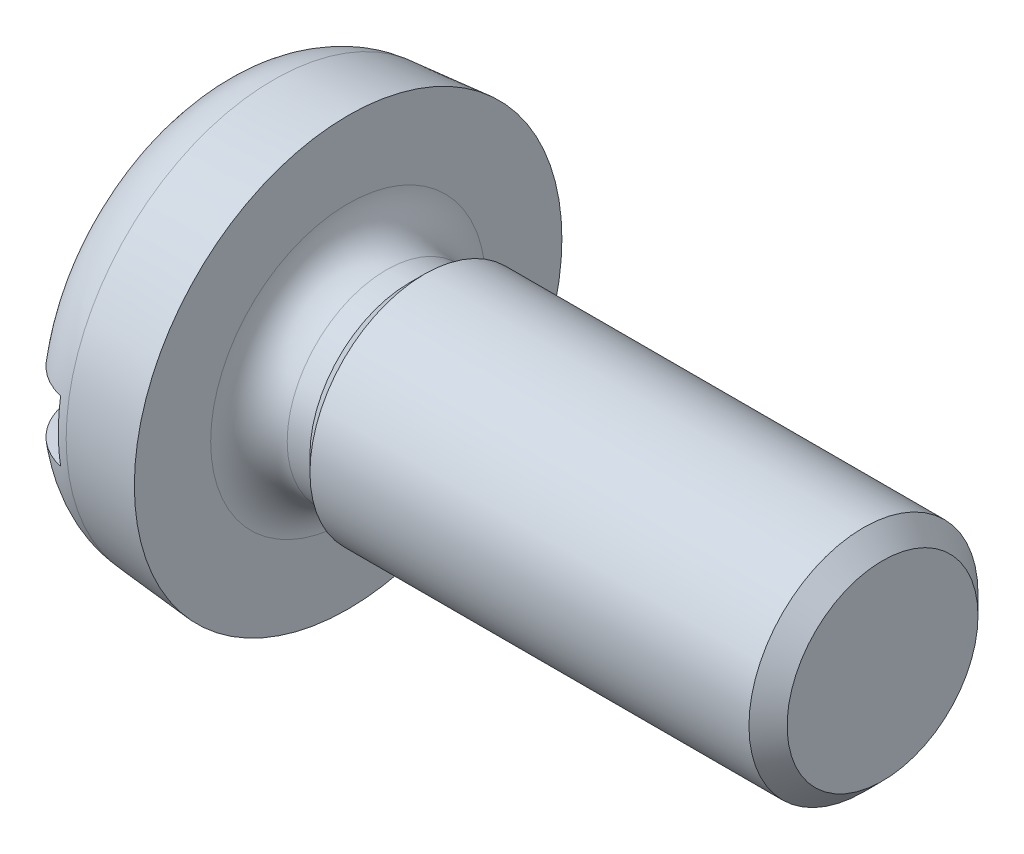
ISO-10303-21;
HEADER;
FILE_DESCRIPTION(('STEP AP214'),'2;1');
FILE_NAME('part.step','',(''),(''),'','','');
FILE_SCHEMA(('AUTOMOTIVE_DESIGN { 1 0 10303 214 1 1 1 1 }'));
ENDSEC;
DATA;
#1=APPLICATION_CONTEXT('core data for automotive mechanical design processes');
#2=APPLICATION_PROTOCOL_DEFINITION('international standard','automotive_design',2000,#1);
#3=PRODUCT_CONTEXT('',#1,'mechanical');
#4=PRODUCT('Part','Part','',(#3));
#5=PRODUCT_RELATED_PRODUCT_CATEGORY('part','',(#4));
#6=PRODUCT_DEFINITION_FORMATION('','',#4);
#7=PRODUCT_DEFINITION_CONTEXT('part definition',#1,'design');
#8=PRODUCT_DEFINITION('design','',#6,#7);
#9=PRODUCT_DEFINITION_SHAPE('','',#8);
#10=(LENGTH_UNIT() NAMED_UNIT(*) SI_UNIT(.MILLI.,.METRE.));
#11=(NAMED_UNIT(*) PLANE_ANGLE_UNIT() SI_UNIT($,.RADIAN.));
#12=(NAMED_UNIT(*) SI_UNIT($,.STERADIAN.) SOLID_ANGLE_UNIT());
#13=UNCERTAINTY_MEASURE_WITH_UNIT(LENGTH_MEASURE(1.E-05),#10,'distance_accuracy_value','');
#14=(GEOMETRIC_REPRESENTATION_CONTEXT(3) GLOBAL_UNCERTAINTY_ASSIGNED_CONTEXT((#13)) GLOBAL_UNIT_ASSIGNED_CONTEXT((#10,
#11,#12)) REPRESENTATION_CONTEXT('',''));
#15=CARTESIAN_POINT('',(0.,0.,0.));
#16=DIRECTION('',(0.,0.,1.));
#17=DIRECTION('',(1.,0.,0.));
#18=AXIS2_PLACEMENT_3D('',#15,#16,#17);
#19=CARTESIAN_POINT('',(-2.4770215242466,0.,0.));
#20=DIRECTION('',(-1.,0.,0.));
#21=DIRECTION('',(0.,0.,1.));
#22=AXIS2_PLACEMENT_3D('',#19,#20,#21);
#23=CYLINDRICAL_SURFACE('',#22,1.5);
#24=CARTESIAN_POINT('',(8.55,0.,0.));
#25=DIRECTION('',(1.,0.,0.));
#26=DIRECTION('',(0.,0.,-1.));
#27=AXIS2_PLACEMENT_3D('',#24,#25,#26);
#28=CIRCLE('',#27,1.5);
#29=CARTESIAN_POINT('',(8.55,0.,-1.5));
#30=VERTEX_POINT('',#29);
#31=EDGE_CURVE('E11',#30,#30,#28,.F.);
#32=ORIENTED_EDGE('',*,*,#31,.T.);
#33=EDGE_LOOP('',(#32));
#34=FACE_BOUND('',#33,.T.);
#35=CARTESIAN_POINT('',(2.8,0.,0.));
#36=DIRECTION('',(-1.,0.,0.));
#37=DIRECTION('',(0.,0.,1.));
#38=AXIS2_PLACEMENT_3D('',#35,#36,#37);
#39=CIRCLE('',#38,1.5);
#40=CARTESIAN_POINT('',(2.8,0.,1.5));
#41=VERTEX_POINT('',#40);
#42=EDGE_CURVE('E163',#41,#41,#39,.T.);
#43=ORIENTED_EDGE('',*,*,#42,.F.);
#44=EDGE_LOOP('',(#43));
#45=FACE_BOUND('',#44,.T.);
#46=ADVANCED_FACE('F39',(#34,#45),#23,.T.);
#47=CARTESIAN_POINT('',(0.,1.81782234903766,0.));
#48=DIRECTION('',(1.,0.,0.));
#49=DIRECTION('',(0.,0.,-1.));
#50=AXIS2_PLACEMENT_3D('',#47,#48,#49);
#51=PLANE('',#50);
#52=CARTESIAN_POINT('',(0.,0.,0.));
#53=DIRECTION('',(-1.,0.,0.));
#54=DIRECTION('',(0.,0.,1.));
#55=AXIS2_PLACEMENT_3D('',#52,#53,#54);
#56=CIRCLE('',#55,1.81782234903766);
#57=CARTESIAN_POINT('',(0.,0.4,1.77326763142533));
#58=VERTEX_POINT('',#57);
#59=CARTESIAN_POINT('',(0.,0.4,-1.77326763142534));
#60=VERTEX_POINT('',#59);
#61=EDGE_CURVE('E98',#58,#60,#56,.T.);
#62=ORIENTED_EDGE('',*,*,#61,.T.);
#63=DIRECTION('',(0.,0.,1.));
#64=VECTOR('',#63,1.);
#65=CARTESIAN_POINT('',(0.,0.4,-50.));
#66=LINE('',#65,#64);
#67=EDGE_CURVE('E166',#60,#58,#66,.T.);
#68=ORIENTED_EDGE('',*,*,#67,.T.);
#69=EDGE_LOOP('',(#62,#68));
#70=FACE_BOUND('',#69,.T.);
#71=ADVANCED_FACE('F154',(#70),#51,.F.);
#72=CARTESIAN_POINT('',(0.,-0.4,-1.77326763142533));
#73=VERTEX_POINT('',#72);
#74=CARTESIAN_POINT('',(0.,-0.4,1.77326763142533));
#75=VERTEX_POINT('',#74);
#76=EDGE_CURVE('E92',#73,#75,#56,.T.);
#77=ORIENTED_EDGE('',*,*,#76,.T.);
#78=DIRECTION('',(0.,0.,1.));
#79=VECTOR('',#78,1.);
#80=CARTESIAN_POINT('',(0.,-0.4,-50.));
#81=LINE('',#80,#79);
#82=EDGE_CURVE('E54',#73,#75,#81,.T.);
#83=ORIENTED_EDGE('',*,*,#82,.F.);
#84=EDGE_LOOP('',(#77,#83));
#85=FACE_BOUND('',#84,.T.);
#86=ADVANCED_FACE('F91',(#85),#51,.F.);
#87=CARTESIAN_POINT('',(0.9,0.,0.));
#88=DIRECTION('',(-1.,0.,0.));
#89=DIRECTION('',(0.,0.,1.));
#90=AXIS2_PLACEMENT_3D('',#87,#88,#89);
#91=TOROIDAL_SURFACE('',#90,1.81782234903766,0.9);
#92=CARTESIAN_POINT('',(0.7,0.,0.));
#93=DIRECTION('',(1.,0.,0.));
#94=DIRECTION('',(0.,1.,0.));
#95=AXIS2_PLACEMENT_3D('',#92,#93,#94);
#96=CIRCLE('',#95,2.69531878777687);
#97=CARTESIAN_POINT('',(0.7,-0.4,-2.66547244738018));
#98=VERTEX_POINT('',#97);
#99=CARTESIAN_POINT('',(0.7,0.4,-2.6654724473802));
#100=VERTEX_POINT('',#99);
#101=EDGE_CURVE('E87',#98,#100,#96,.T.);
#102=ORIENTED_EDGE('',*,*,#101,.T.);
#103=CARTESIAN_POINT('',(0.401696093511728,0.4,-2.5359315211413));
#104=CARTESIAN_POINT('',(0.359499569861718,0.4,-2.5075259485387));
#105=CARTESIAN_POINT('',(0.319690458635451,0.4,-2.47549983982047));
#106=CARTESIAN_POINT('',(0.246006645656665,0.4,-2.40516587836491));
#107=CARTESIAN_POINT('',(0.212140132740977,0.4,-2.36684949616947));
#108=CARTESIAN_POINT('',(0.151336229791142,0.4,-2.28512812362889));
#109=CARTESIAN_POINT('',(0.124391330893495,0.4,-2.24172872264132));
#110=CARTESIAN_POINT('',(0.0780875903765086,0.4,-2.15107708021563));
#111=CARTESIAN_POINT('',(0.0587267801703001,0.4,-2.10382584244336));
#112=CARTESIAN_POINT('',(0.027857498958102,0.4,-2.00623443962712));
#113=CARTESIAN_POINT('',(0.0164409014532912,0.4,-1.95586524023864));
#114=CARTESIAN_POINT('',(0.00203581031766659,0.4,-1.85393618870856));
#115=CARTESIAN_POINT('',(-0.000951523403916627,0.4,-1.80237617368878));
#116=CARTESIAN_POINT('',(0.00150541182221372,0.4,-1.69835894015113));
#117=CARTESIAN_POINT('',(0.00713078743956886,0.4,-1.64590602749594));
#118=CARTESIAN_POINT('',(0.0268851706508878,0.4,-1.54262865024756));
#119=CARTESIAN_POINT('',(0.0410152341853261,0.4,-1.49180438869282));
#120=CARTESIAN_POINT('',(0.0777693985439929,0.4,-1.39187524119995));
#121=CARTESIAN_POINT('',(0.100597428420282,0.4,-1.34284532896704));
#122=CARTESIAN_POINT('',(0.15402866550075,0.4,-1.24921236961779));
#123=CARTESIAN_POINT('',(0.184633577370677,0.4,-1.20461029605317));
#124=CARTESIAN_POINT('',(0.253369835088767,0.4,-1.12040413132918));
#125=CARTESIAN_POINT('',(0.291615661801268,0.4,-1.08089328983158));
#126=CARTESIAN_POINT('',(0.374350758887981,0.4,-1.00902344925027));
#127=CARTESIAN_POINT('',(0.418840522733277,0.4,-0.976665015956939));
#128=CARTESIAN_POINT('',(0.511731904475919,0.4,-0.921153761550267));
#129=CARTESIAN_POINT('',(0.56000602416032,0.4,-0.897788688316848));
#130=CARTESIAN_POINT('',(0.660033558527158,0.4,-0.860397113393035));
#131=CARTESIAN_POINT('',(0.711783369409339,0.4,-0.84636109847688));
#132=CARTESIAN_POINT('',(0.812389224940537,0.4,-0.829368295388304));
#133=CARTESIAN_POINT('',(0.861099258735353,0.4,-0.825545352440839));
#134=CARTESIAN_POINT('',(0.95840589915131,0.4,-0.826719597327256));
#135=CARTESIAN_POINT('',(1.00700253299767,0.4,-0.831714388722311));
#136=CARTESIAN_POINT('',(1.0996760197852,0.4,-0.849623301413398));
#137=CARTESIAN_POINT('',(1.14384950549969,0.4,-0.862046867571486));
#138=CARTESIAN_POINT('',(1.22966211525765,0.4,-0.893742217847718));
#139=CARTESIAN_POINT('',(1.27130051154861,0.4,-0.913015957700831));
#140=CARTESIAN_POINT('',(1.35338723347829,0.4,-0.958876506944374));
#141=CARTESIAN_POINT('',(1.39364158740159,0.4,-0.98580952636012));
#142=CARTESIAN_POINT('',(1.46954671268381,0.4,-1.04552244383328));
#143=CARTESIAN_POINT('',(1.50519595694897,0.4,-1.07830427286892));
#144=CARTESIAN_POINT('',(1.5741481223088,0.4,-1.15198864954588));
#145=CARTESIAN_POINT('',(1.60695638421133,0.4,-1.19335517911256));
#146=CARTESIAN_POINT('',(1.66548530867698,0.4,-1.28083525691766));
#147=CARTESIAN_POINT('',(1.69120428590285,0.4,-1.32694993036067));
#148=CARTESIAN_POINT('',(1.73572700911521,0.4,-1.4246280193911));
#149=CARTESIAN_POINT('',(1.75421770319601,0.4,-1.47633466387387));
#150=CARTESIAN_POINT('',(1.78217546204147,0.4,-1.58213636524116));
#151=CARTESIAN_POINT('',(1.79164262802123,0.4,-1.63623139532852));
#152=CARTESIAN_POINT('',(1.80111834789599,0.4,-1.74478524431539));
#153=CARTESIAN_POINT('',(1.80120671421375,0.4,-1.79923704907971));
#154=CARTESIAN_POINT('',(1.79199564422116,0.4,-1.90734333327446));
#155=CARTESIAN_POINT('',(1.78269735807886,0.4,-1.96099790957379));
#156=CARTESIAN_POINT('',(1.75522804290983,0.4,-2.06455754692508));
#157=CARTESIAN_POINT('',(1.73728348499548,0.4,-2.1145226785071));
#158=CARTESIAN_POINT('',(1.69306568307316,0.4,-2.21062233517153));
#159=CARTESIAN_POINT('',(1.66679349701772,0.4,-2.25675734589842));
#160=CARTESIAN_POINT('',(1.60733395224623,0.4,-2.34276585756037));
#161=CARTESIAN_POINT('',(1.57431956056638,0.4,-2.38275897803033));
#162=CARTESIAN_POINT('',(1.50194333073533,0.4,-2.45651788071981));
#163=CARTESIAN_POINT('',(1.46258208977932,0.4,-2.49028424819413));
#164=CARTESIAN_POINT('',(1.37933549559489,0.4,-2.55005790908045));
#165=CARTESIAN_POINT('',(1.33553510744259,0.4,-2.57618357878773));
#166=CARTESIAN_POINT('',(1.24413819843943,0.4,-2.62062313067505));
#167=CARTESIAN_POINT('',(1.19654207131845,0.4,-2.6389378218357));
#168=CARTESIAN_POINT('',(1.09942378961358,0.4,-2.66705979300268));
#169=CARTESIAN_POINT('',(1.0499260157382,0.4,-2.67695133394455));
#170=CARTESIAN_POINT('',(0.949957006468675,0.4,-2.688245038623));
#171=CARTESIAN_POINT('',(0.899485546015457,0.4,-2.6896452154879));
#172=CARTESIAN_POINT('',(0.799232995516733,0.4,-2.68392343190627));
#173=CARTESIAN_POINT('',(0.749449974424365,0.4,-2.67683486710843));
#174=CARTESIAN_POINT('',(0.651826495741724,0.4,-2.65440372943722));
#175=CARTESIAN_POINT('',(0.603983614927445,0.4,-2.63907181676456));
#176=CARTESIAN_POINT('',(0.530466612644572,0.4,-2.6085024080847));
#177=CARTESIAN_POINT('',(0.503717386474933,0.4,-2.59578274416443));
#178=CARTESIAN_POINT('',(0.451608060549779,0.4,-2.56776112348694));
#179=CARTESIAN_POINT('',(0.426247954611342,0.4,-2.55245917822459));
#180=CARTESIAN_POINT('',(0.401696093511728,0.4,-2.5359315211413));
#181=B_SPLINE_CURVE_WITH_KNOTS('',3,(#103,#104,#105,#106,#107,#108,#109,#110,#111,#112,#113,
#114,#115,#116,#117,#118,#119,#120,#121,#122,#123,#124,#125,#126,#127,#128,#129,#130,#131,#132,
#133,#134,#135,#136,#137,#138,#139,#140,#141,#142,#143,#144,#145,#146,#147,#148,#149,#150,#151,
#152,#153,#154,#155,#156,#157,#158,#159,#160,#161,#162,#163,#164,#165,#166,#167,#168,#169,#170,
#171,#172,#173,#174,#175,#176,#177,#178,#179,#180),.UNSPECIFIED.,.T.,.F.,(4,2,2,2,2,2,2,2,2,2,2,
2,2,2,2,2,2,2,2,2,2,2,2,2,2,2,2,2,2,2,2,2,2,2,2,2,2,2,4),(0.,0.152490218607282,
0.305188944540642,0.457721310022948,0.61021405670459,0.764442291671229,0.91869174818651,
1.07622956938612,1.23378695448846,1.39529155818188,1.55683159371206,1.72100303477019,
1.88518745794618,2.0452166605768,2.2050824234249,2.3508822697905,2.49664249751799,
2.63370136587138,2.77079939621414,2.91549848817681,3.06024544108866,3.21793237831143,
3.37565677021802,3.539607260158,3.70355591107662,3.86610926645174,4.02864270620865,
4.18713298434998,4.34560313574806,4.5004280819907,4.65523846875457,4.80750509346896,
4.95975594414436,5.11046523737449,5.26120979331062,5.41136324663485,5.5613229886773,
5.65004914448151,5.73877490533681),.UNSPECIFIED.);
#182=EDGE_CURVE('E133',#100,#60,#181,.T.);
#183=ORIENTED_EDGE('',*,*,#182,.T.);
#184=ORIENTED_EDGE('',*,*,#61,.F.);
#185=CARTESIAN_POINT('',(0.631175220468884,0.4,0.871495981540634));
#186=CARTESIAN_POINT('',(0.582440056051629,0.4,0.888281741940895));
#187=CARTESIAN_POINT('',(0.535174963055645,0.4,0.909503716497953));
#188=CARTESIAN_POINT('',(0.44490346751275,0.4,0.959728629210842));
#189=CARTESIAN_POINT('',(0.401907569369315,0.4,0.988750138784305));
#190=CARTESIAN_POINT('',(0.321399331874221,0.4,1.05330679583532));
#191=CARTESIAN_POINT('',(0.283866824101227,0.4,1.08881683540863));
#192=CARTESIAN_POINT('',(0.214947035166148,0.4,1.16532583126717));
#193=CARTESIAN_POINT('',(0.183557026279775,0.4,1.20632233747313));
#194=CARTESIAN_POINT('',(0.126173306630208,0.4,1.29499806178717));
#195=CARTESIAN_POINT('',(0.100543812186155,0.4,1.34291357063033));
#196=CARTESIAN_POINT('',(0.0575990442880287,0.4,1.44234685085245));
#197=CARTESIAN_POINT('',(0.0402853165841826,0.4,1.4938652899135));
#198=CARTESIAN_POINT('',(0.0144295468099875,0.4,1.59957722380882));
#199=CARTESIAN_POINT('',(0.00597091020770713,0.4,1.65379120331089));
#200=CARTESIAN_POINT('',(-0.00151505119498209,0.4,1.76286943896087));
#201=CARTESIAN_POINT('',(-0.000543260661566062,0.4,1.81773363362999));
#202=CARTESIAN_POINT('',(0.0108063117868815,0.4,1.92531903415647));
#203=CARTESIAN_POINT('',(0.0209864254781901,0.4,1.97806105250491));
#204=CARTESIAN_POINT('',(0.0502872770681109,0.4,2.08100191154855));
#205=CARTESIAN_POINT('',(0.0694067748926917,0.4,2.13120110391517));
#206=CARTESIAN_POINT('',(0.11551380682455,0.4,2.22629801812597));
#207=CARTESIAN_POINT('',(0.142292886113339,0.4,2.2712968402762));
#208=CARTESIAN_POINT('',(0.203167661896692,0.4,2.35603997582291));
#209=CARTESIAN_POINT('',(0.237262555060447,0.4,2.39578486536654));
#210=CARTESIAN_POINT('',(0.311072150151849,0.4,2.46808210682477));
#211=CARTESIAN_POINT('',(0.350664393955091,0.4,2.50075952492732));
#212=CARTESIAN_POINT('',(0.434832405726089,0.4,2.5589005223482));
#213=CARTESIAN_POINT('',(0.479407789016663,0.4,2.58436465796571));
#214=CARTESIAN_POINT('',(0.571659032279252,0.4,2.62702917155575));
#215=CARTESIAN_POINT('',(0.619288022556018,0.4,2.64433093880065));
#216=CARTESIAN_POINT('',(0.71678574482263,0.4,2.67063086398604));
#217=CARTESIAN_POINT('',(0.766654377625561,0.4,2.67962938927217));
#218=CARTESIAN_POINT('',(0.866851086765476,0.4,2.68902063968357));
#219=CARTESIAN_POINT('',(0.917173710289187,0.4,2.68947163706795));
#220=CARTESIAN_POINT('',(1.01717730229026,0.4,2.6819038236589));
#221=CARTESIAN_POINT('',(1.06685828235616,0.4,2.67388516605055));
#222=CARTESIAN_POINT('',(1.16408913364714,0.4,2.64963561785688));
#223=CARTESIAN_POINT('',(1.21164224901621,0.4,2.63341772685544));
#224=CARTESIAN_POINT('',(1.30336357324318,0.4,2.59325489856321));
#225=CARTESIAN_POINT('',(1.34753176252251,0.4,2.56930991658272));
#226=CARTESIAN_POINT('',(1.43140121230963,0.4,2.5142988251124));
#227=CARTESIAN_POINT('',(1.47108662202344,0.4,2.48320855787323));
#228=CARTESIAN_POINT('',(1.54472936336671,0.4,2.41485918396245));
#229=CARTESIAN_POINT('',(1.57868652408326,0.4,2.3775998932923));
#230=CARTESIAN_POINT('',(1.64024044205203,0.4,2.29763356977095));
#231=CARTESIAN_POINT('',(1.66777905671271,0.4,2.25488179824851));
#232=CARTESIAN_POINT('',(1.71540533966796,0.4,2.16541487025926));
#233=CARTESIAN_POINT('',(1.73549258796613,0.4,2.11869949056592));
#234=CARTESIAN_POINT('',(1.76797944190081,0.4,2.02190542768206));
#235=CARTESIAN_POINT('',(1.78026184844694,0.4,1.97178743470806));
#236=CARTESIAN_POINT('',(1.79642443017794,0.4,1.87021727726406));
#237=CARTESIAN_POINT('',(1.80030382576996,0.4,1.81876498945238));
#238=CARTESIAN_POINT('',(1.79965225810416,0.4,1.71483495243174));
#239=CARTESIAN_POINT('',(1.79494304519989,0.4,1.66235834857244));
#240=CARTESIAN_POINT('',(1.77700429154566,0.4,1.55888409709203));
#241=CARTESIAN_POINT('',(1.76377367047763,0.4,1.50788663784913));
#242=CARTESIAN_POINT('',(1.72880303252309,0.4,1.40746214507164));
#243=CARTESIAN_POINT('',(1.7068583172022,0.4,1.35810636780322));
#244=CARTESIAN_POINT('',(1.6551362081094,0.4,1.26367602901191));
#245=CARTESIAN_POINT('',(1.62535713115486,0.4,1.21860239032602));
#246=CARTESIAN_POINT('',(1.55817582249343,0.4,1.13325277423328));
#247=CARTESIAN_POINT('',(1.52065002148733,0.4,1.093073866885));
#248=CARTESIAN_POINT('',(1.43925099604234,0.4,1.01972901550195));
#249=CARTESIAN_POINT('',(1.39537733695676,0.4,0.986563552070555));
#250=CARTESIAN_POINT('',(1.30343025383385,0.4,0.929222350042143));
#251=CARTESIAN_POINT('',(1.25547156560025,0.4,0.904863533629862));
#252=CARTESIAN_POINT('',(1.15587516450287,0.4,0.865408006374142));
#253=CARTESIAN_POINT('',(1.10423998181313,0.4,0.850304993129935));
#254=CARTESIAN_POINT('',(1.00351728354307,0.4,0.83123572972726));
#255=CARTESIAN_POINT('',(0.954588162116061,0.4,0.826429393731622));
#256=CARTESIAN_POINT('',(0.85672056388597,0.4,0.825757597618521));
#257=CARTESIAN_POINT('',(0.807782255217162,0.4,0.829876411240608));
#258=CARTESIAN_POINT('',(0.73783975584557,0.4,0.842103164129616));
#259=CARTESIAN_POINT('',(0.716186869313667,0.4,0.846800488735413));
#260=CARTESIAN_POINT('',(0.673323995455613,0.4,0.857891117601629));
#261=CARTESIAN_POINT('',(0.652113925657397,0.4,0.864284102959967));
#262=CARTESIAN_POINT('',(0.631175220468884,0.4,0.871495981540634));
#263=B_SPLINE_CURVE_WITH_KNOTS('',3,(#185,#186,#187,#188,#189,#190,#191,#192,#193,#194,#195,
#196,#197,#198,#199,#200,#201,#202,#203,#204,#205,#206,#207,#208,#209,#210,#211,#212,#213,#214,
#215,#216,#217,#218,#219,#220,#221,#222,#223,#224,#225,#226,#227,#228,#229,#230,#231,#232,#233,
#234,#235,#236,#237,#238,#239,#240,#241,#242,#243,#244,#245,#246,#247,#248,#249,#250,#251,#252,
#253,#254,#255,#256,#257,#258,#259,#260,#261,#262),.UNSPECIFIED.,.T.,.F.,(4,2,2,2,2,2,2,2,2,2,2,
2,2,2,2,2,2,2,2,2,2,2,2,2,2,2,2,2,2,2,2,2,2,2,2,2,2,2,4),(0.,0.154545929505513,
0.309463158544144,0.463793151236126,0.618054453677577,0.780314715588442,0.942605127077749,
1.10641075199289,1.27020101048904,1.43055663497238,1.59089002147254,1.74721863073234,
1.90353008272412,2.0567955472543,2.21004918850169,2.3613455070347,2.5126351317113,
2.66289297461213,2.81314809994484,2.96316574487771,3.11318425745476,3.26371763526343,
3.41425550371989,3.56610818035137,3.71796941486144,3.87206025933958,4.02616539904814,
4.18350533199931,4.3408652159535,4.50216376271748,4.66349699219781,4.82763600715277,
4.9917862662581,5.15229563882414,5.3126955966153,5.45941323508264,5.60587256489849,
5.67228456882567,5.73868409152544),.UNSPECIFIED.);
#264=CARTESIAN_POINT('',(0.7,0.4,2.6654724473802));
#265=VERTEX_POINT('',#264);
#266=EDGE_CURVE('E62',#58,#265,#263,.T.);
#267=ORIENTED_EDGE('',*,*,#266,.T.);
#268=CARTESIAN_POINT('',(0.7,-0.4,2.66547244737991));
#269=VERTEX_POINT('',#268);
#270=EDGE_CURVE('E113',#265,#269,#96,.T.);
#271=ORIENTED_EDGE('',*,*,#270,.T.);
#272=CARTESIAN_POINT('',(0.631175220468884,-0.4,0.871495981540634));
#273=CARTESIAN_POINT('',(0.674904543341189,-0.4,0.856438796500038));
#274=CARTESIAN_POINT('',(0.719878263159749,-0.4,0.844929838444246));
#275=CARTESIAN_POINT('',(0.811135722097475,-0.399999999999999,0.829645582358342));
#276=CARTESIAN_POINT('',(0.857419653490013,-0.399999999999999,0.825871425436578));
#277=CARTESIAN_POINT('',(0.94996765771277,-0.399999999999999,0.826292946243286));
#278=CARTESIAN_POINT('',(0.99623171899819,-0.399999999999999,0.830491246695733));
#279=CARTESIAN_POINT('',(1.08739120729823,-0.399999999999999,0.846603737630672));
#280=CARTESIAN_POINT('',(1.13228633060722,-0.399999999999999,0.858519627443423));
#281=CARTESIAN_POINT('',(1.21961165117639,-0.399999999999999,0.88944947112413));
#282=CARTESIAN_POINT('',(1.26203829733493,-0.399999999999999,0.908473372222475));
#283=CARTESIAN_POINT('',(1.34345634110223,-0.399999999999999,0.952815473313936));
#284=CARTESIAN_POINT('',(1.38244667242382,-0.399999999999999,0.978135617780094));
#285=CARTESIAN_POINT('',(1.4594377621541,-0.399999999999999,1.03667706350998));
#286=CARTESIAN_POINT('',(1.49706398720203,-0.399999999999999,1.07039108297029));
#287=CARTESIAN_POINT('',(1.56659895295036,-0.399999999999999,1.14327535241886));
#288=CARTESIAN_POINT('',(1.59850581805068,-0.399999999999999,1.18244738484379));
#289=CARTESIAN_POINT('',(1.65794109406934,-0.399999999999999,1.26820361081834));
#290=CARTESIAN_POINT('',(1.68499616118368,-0.399999999999999,1.31511693869778));
#291=CARTESIAN_POINT('',(1.73097615311023,-0.399999999999999,1.41277630231544));
#292=CARTESIAN_POINT('',(1.74990014079754,-0.399999999999999,1.46352277904049));
#293=CARTESIAN_POINT('',(1.77921631303595,-0.399999999999999,1.56819037296416));
#294=CARTESIAN_POINT('',(1.78948692404479,-0.399999999999999,1.62214568122432));
#295=CARTESIAN_POINT('',(1.80062989577949,-0.399999999999999,1.73102148257416));
#296=CARTESIAN_POINT('',(1.80150300404476,-0.399999999999999,1.7859418985447));
#297=CARTESIAN_POINT('',(1.79377570144154,-0.399999999999999,1.89403950300679));
#298=CARTESIAN_POINT('',(1.78535947623961,-0.399999999999999,1.94722981003805));
#299=CARTESIAN_POINT('',(1.75948035152466,-0.399999999999999,2.05136420293337));
#300=CARTESIAN_POINT('',(1.74201866082191,-0.399999999999999,2.1023085879492));
#301=CARTESIAN_POINT('',(1.69903294428936,-0.399999999999999,2.19913655373111));
#302=CARTESIAN_POINT('',(1.67372338322898,-0.399999999999999,2.2451153721827));
#303=CARTESIAN_POINT('',(1.61559302758182,-0.399999999999999,2.33205182310156));
#304=CARTESIAN_POINT('',(1.58277310246186,-0.399999999999999,2.37301003595673));
#305=CARTESIAN_POINT('',(1.51127974813898,-0.399999999999999,2.44787841079592));
#306=CARTESIAN_POINT('',(1.47273752290481,-0.399999999999999,2.48191390856889));
#307=CARTESIAN_POINT('',(1.39041996071933,-0.399999999999999,2.54292499319194));
#308=CARTESIAN_POINT('',(1.34664504043413,-0.399999999999999,2.56990114161511));
#309=CARTESIAN_POINT('',(1.25574182443869,-0.399999999999999,2.61566191750627));
#310=CARTESIAN_POINT('',(1.20866632391598,-0.399999999999999,2.63455146707593));
#311=CARTESIAN_POINT('',(1.11199802813735,-0.399999999999999,2.66409285611722));
#312=CARTESIAN_POINT('',(1.06240535215686,-0.399999999999999,2.67474508552362));
#313=CARTESIAN_POINT('',(0.962502526653354,-0.399999999999999,2.68744471269732));
#314=CARTESIAN_POINT('',(0.912200346253428,-0.399999999999999,2.6895548772682));
#315=CARTESIAN_POINT('',(0.811958811975333,-0.399999999999999,2.68528081529453));
#316=CARTESIAN_POINT('',(0.762019450666031,-0.399999999999999,2.67889676322146));
#317=CARTESIAN_POINT('',(0.664027531989636,-0.4,2.65784627208927));
#318=CARTESIAN_POINT('',(0.615971279375596,-0.4,2.64319702247401));
#319=CARTESIAN_POINT('',(0.522990210676869,-0.4,2.60606123058608));
#320=CARTESIAN_POINT('',(0.478065406672586,-0.4,2.58357465808085));
#321=CARTESIAN_POINT('',(0.392472109536806,-0.4,2.53134616302212));
#322=CARTESIAN_POINT('',(0.351816515703726,-0.4,2.50158310815032));
#323=CARTESIAN_POINT('',(0.276029509997111,-0.4,2.43570485136041));
#324=CARTESIAN_POINT('',(0.240898244430081,-0.4,2.39958948126101));
#325=CARTESIAN_POINT('',(0.176835333350467,-0.4,2.32172709740984));
#326=CARTESIAN_POINT('',(0.147956836829551,-0.4,2.27993636985612));
#327=CARTESIAN_POINT('',(0.09751513210716,-0.4,2.19215427977415));
#328=CARTESIAN_POINT('',(0.0759523258739361,-0.4,2.14616268660111));
#329=CARTESIAN_POINT('',(0.0404117526562697,-0.4,2.0506003181404));
#330=CARTESIAN_POINT('',(0.0265449840419451,-0.4,2.00098828619734));
#331=CARTESIAN_POINT('',(0.00715737687929568,-0.4,1.90016214005585));
#332=CARTESIAN_POINT('',(0.00163730520276098,-0.4,1.84894787909014));
#333=CARTESIAN_POINT('',(-0.00103646856464789,-0.4,1.74525626284436));
#334=CARTESIAN_POINT('',(0.00198298502720472,-0.4,1.692774471539));
#335=CARTESIAN_POINT('',(0.0165672576861169,-0.4,1.58901624597821));
#336=CARTESIAN_POINT('',(0.0281327748436763,-0.4,1.53773991054426));
#337=CARTESIAN_POINT('',(0.0597928723844855,-0.4,1.43649219995258));
#338=CARTESIAN_POINT('',(0.0800919231210302,-0.4,1.38658475520861));
#339=CARTESIAN_POINT('',(0.128628670781472,-0.4,1.29076759544656));
#340=CARTESIAN_POINT('',(0.156870001205799,-0.4,1.2448597228063));
#341=CARTESIAN_POINT('',(0.221149361739105,-0.4,1.15746425330815));
#342=CARTESIAN_POINT('',(0.257329693538456,-0.4,1.11608124200677));
#343=CARTESIAN_POINT('',(0.336199031863132,-0.4,1.0401128547597));
#344=CARTESIAN_POINT('',(0.378880772489417,-0.4,1.00551998779309));
#345=CARTESIAN_POINT('',(0.456345744826251,-0.4,0.953377181098873));
#346=CARTESIAN_POINT('',(0.489781510585736,-0.4,0.933802963989656));
#347=CARTESIAN_POINT('',(0.558913558209209,-0.4,0.899158166013489));
#348=CARTESIAN_POINT('',(0.594609343085407,-0.4,0.884086599134749));
#349=CARTESIAN_POINT('',(0.631175220468884,-0.4,0.871495981540634));
#350=B_SPLINE_CURVE_WITH_KNOTS('',3,(#272,#273,#274,#275,#276,#277,#278,#279,#280,#281,#282,
#283,#284,#285,#286,#287,#288,#289,#290,#291,#292,#293,#294,#295,#296,#297,#298,#299,#300,#301,
#302,#303,#304,#305,#306,#307,#308,#309,#310,#311,#312,#313,#314,#315,#316,#317,#318,#319,#320,
#321,#322,#323,#324,#325,#326,#327,#328,#329,#330,#331,#332,#333,#334,#335,#336,#337,#338,#339,
#340,#341,#342,#343,#344,#345,#346,#347,#348,#349),.UNSPECIFIED.,.T.,.F.,(4,2,2,2,2,2,2,2,2,2,2,
2,2,2,2,2,2,2,2,2,2,2,2,2,2,2,2,2,2,2,2,2,2,2,2,2,2,2,4),(0.,0.138615612916104,
0.277251674198893,0.415933350916858,0.554645574236208,0.693552648422648,0.832502674767946,
0.983421485118333,1.13438969741741,1.29610427307939,1.45783748170807,1.62180673071881,
1.78576293643649,1.94652574714201,2.10726707950299,2.2639540446038,2.42062287939072,
2.57413636036031,2.72763762557717,2.87908198292273,3.03051917082038,3.18084156107108,
3.33116086374289,3.4811686879926,3.63117709090574,3.78162643331956,3.93207975956823,
4.08376569017546,4.23545995397545,4.38928870771081,4.54313159395465,4.70011617891189,
4.85711358867004,5.01800577434983,5.17897168640495,5.34310060642745,5.50704742574204,
5.62298136153754,5.73888989092701),.UNSPECIFIED.);
#351=EDGE_CURVE('E97',#269,#75,#350,.T.);
#352=ORIENTED_EDGE('',*,*,#351,.T.);
#353=ORIENTED_EDGE('',*,*,#76,.F.);
#354=CARTESIAN_POINT('',(0.401696093511728,-0.4,-2.5359315211413));
#355=CARTESIAN_POINT('',(0.443301117774008,-0.4,-2.56393332788218));
#356=CARTESIAN_POINT('',(0.48728921147468,-0.4,-2.58845843023253));
#357=CARTESIAN_POINT('',(0.578792425576941,-0.4,-2.62980192456993));
#358=CARTESIAN_POINT('',(0.626311517541325,-0.4,-2.64661148109402));
#359=CARTESIAN_POINT('',(0.723491694345221,-0.399999999999999,-2.67199528317046));
#360=CARTESIAN_POINT('',(0.77315217005018,-0.399999999999999,-2.68057185472611));
#361=CARTESIAN_POINT('',(0.873195470603058,-0.399999999999999,-2.68923740018579));
#362=CARTESIAN_POINT('',(0.923578118909892,-0.399999999999999,-2.68932841422143));
#363=CARTESIAN_POINT('',(1.02350797374872,-0.399999999999999,-2.68103738118983));
#364=CARTESIAN_POINT('',(1.07305702227845,-0.399999999999999,-2.67267751789981));
#365=CARTESIAN_POINT('',(1.17005159771854,-0.399999999999999,-2.64776531442095));
#366=CARTESIAN_POINT('',(1.21749706154432,-0.399999999999999,-2.63121272872073));
#367=CARTESIAN_POINT('',(1.30899463227735,-0.399999999999999,-2.59038229907008));
#368=CARTESIAN_POINT('',(1.35304326494453,-0.399999999999999,-2.5660966726896));
#369=CARTESIAN_POINT('',(1.43646971838795,-0.399999999999999,-2.51051742624854));
#370=CARTESIAN_POINT('',(1.47584746170715,-0.399999999999999,-2.47922368999777));
#371=CARTESIAN_POINT('',(1.54908472891299,-0.399999999999999,-2.41032419236435));
#372=CARTESIAN_POINT('',(1.58290894495081,-0.399999999999999,-2.37268091273685));
#373=CARTESIAN_POINT('',(1.64384285536696,-0.399999999999999,-2.29230689336046));
#374=CARTESIAN_POINT('',(1.67095227126419,-0.399999999999999,-2.24957594272073));
#375=CARTESIAN_POINT('',(1.71804431058735,-0.399999999999999,-2.15971237578419));
#376=CARTESIAN_POINT('',(1.73793948776457,-0.399999999999999,-2.11253395536872));
#377=CARTESIAN_POINT('',(1.76968090770725,-0.399999999999999,-2.01554593245494));
#378=CARTESIAN_POINT('',(1.78152655521718,-0.399999999999999,-1.96573613566218));
#379=CARTESIAN_POINT('',(1.79707863209083,-0.399999999999999,-1.86394560462762));
#380=CARTESIAN_POINT('',(1.80063474217523,-0.399999999999999,-1.81194193297292));
#381=CARTESIAN_POINT('',(1.79917918253395,-0.399999999999999,-1.70805700113295));
#382=CARTESIAN_POINT('',(1.79416652473772,-0.399999999999999,-1.65617575575555));
#383=CARTESIAN_POINT('',(1.7755943642346,-0.399999999999999,-1.55269446133054));
#384=CARTESIAN_POINT('',(1.76183474132893,-0.399999999999999,-1.5011303417722));
#385=CARTESIAN_POINT('',(1.72605722331735,-0.399999999999999,-1.40095096381718));
#386=CARTESIAN_POINT('',(1.70403814128862,-0.399999999999999,-1.35233613041374));
#387=CARTESIAN_POINT('',(1.65177086981811,-0.399999999999999,-1.25824022538736));
#388=CARTESIAN_POINT('',(1.62134113345016,-0.399999999999999,-1.21285988807693));
#389=CARTESIAN_POINT('',(1.55331109595649,-0.399999999999999,-1.12780932458798));
#390=CARTESIAN_POINT('',(1.51570875984687,-0.399999999999999,-1.08814072454133));
#391=CARTESIAN_POINT('',(1.43418773757712,-0.399999999999999,-1.01571120097084));
#392=CARTESIAN_POINT('',(1.39025557046043,-0.399999999999999,-0.982965398150434));
#393=CARTESIAN_POINT('',(1.29725173640542,-0.399999999999999,-0.925820211344964));
#394=CARTESIAN_POINT('',(1.24818246394632,-0.399999999999999,-0.901416961201444));
#395=CARTESIAN_POINT('',(1.1492196326343,-0.399999999999999,-0.863395366502837));
#396=CARTESIAN_POINT('',(1.09953332116632,-0.399999999999999,-0.849240526280149));
#397=CARTESIAN_POINT('',(0.998407326739823,-0.399999999999999,-0.83045084757067));
#398=CARTESIAN_POINT('',(0.946969290105793,-0.399999999999999,-0.825807308120576));
#399=CARTESIAN_POINT('',(0.848928720965479,-0.399999999999999,-0.826338661096811));
#400=CARTESIAN_POINT('',(0.802319233875119,-0.399999999999999,-0.830644672645151));
#401=CARTESIAN_POINT('',(0.710503550748046,-0.4,-0.847082675101292));
#402=CARTESIAN_POINT('',(0.665297586491215,-0.4,-0.859215951485942));
#403=CARTESIAN_POINT('',(0.577725921687514,-0.4,-0.890561229701261));
#404=CARTESIAN_POINT('',(0.5353454513578,-0.4,-0.909732336345559));
#405=CARTESIAN_POINT('',(0.454039585142495,-0.4,-0.954356114786265));
#406=CARTESIAN_POINT('',(0.415115190169609,-0.4,-0.979810598293171));
#407=CARTESIAN_POINT('',(0.338258283652573,-0.4,-1.03863563377017));
#408=CARTESIAN_POINT('',(0.300704584388947,-0.4,-1.07250127234658));
#409=CARTESIAN_POINT('',(0.231340396591253,-0.4,-1.14567873524744));
#410=CARTESIAN_POINT('',(0.199531837361427,-0.4,-1.18499238129111));
#411=CARTESIAN_POINT('',(0.140343537062657,-0.4,-1.27100479329442));
#412=CARTESIAN_POINT('',(0.113435239263174,-0.4,-1.31802904125809));
#413=CARTESIAN_POINT('',(0.0677697881199934,-0.4,-1.41588613859262));
#414=CARTESIAN_POINT('',(0.0490135480549558,-0.4,-1.46671941394301));
#415=CARTESIAN_POINT('',(0.0200605085740849,-0.4,-1.57150752749652));
#416=CARTESIAN_POINT('',(0.00998112078324528,-0.4,-1.62549494001756));
#417=CARTESIAN_POINT('',(-0.00077445947464513,-0.4,-1.73439964710516));
#418=CARTESIAN_POINT('',(-0.00145178031293696,-0.4,-1.78931682929513));
#419=CARTESIAN_POINT('',(0.00665978805998382,-0.4,-1.8973585349181));
#420=CARTESIAN_POINT('',(0.0152619165789974,-0.4,-1.95049703954292));
#421=CARTESIAN_POINT('',(0.0415044362784367,-0.4,-2.05451158025994));
#422=CARTESIAN_POINT('',(0.0591459771853458,-0.4,-2.10538732765633));
#423=CARTESIAN_POINT('',(0.102479617855353,-0.4,-2.2020710625533));
#424=CARTESIAN_POINT('',(0.127962009730159,-0.4,-2.24797321246303));
#425=CARTESIAN_POINT('',(0.186405952526769,-0.4,-2.33468266737611));
#426=CARTESIAN_POINT('',(0.219357119954584,-0.4,-2.37549692488184));
#427=CARTESIAN_POINT('',(0.277651799171599,-0.4,-2.43611780517027));
#428=CARTESIAN_POINT('',(0.300961246504244,-0.4,-2.45791602542563));
#429=CARTESIAN_POINT('',(0.349758108963351,-0.4,-2.4989217294122));
#430=CARTESIAN_POINT('',(0.375245501851939,-0.4,-2.51812923959064));
#431=CARTESIAN_POINT('',(0.401696093511728,-0.4,-2.5359315211413));
#432=B_SPLINE_CURVE_WITH_KNOTS('',3,(#354,#355,#356,#357,#358,#359,#360,#361,#362,#363,#364,
#365,#366,#367,#368,#369,#370,#371,#372,#373,#374,#375,#376,#377,#378,#379,#380,#381,#382,#383,
#384,#385,#386,#387,#388,#389,#390,#391,#392,#393,#394,#395,#396,#397,#398,#399,#400,#401,#402,
#403,#404,#405,#406,#407,#408,#409,#410,#411,#412,#413,#414,#415,#416,#417,#418,#419,#420,#421,
#422,#423,#424,#425,#426,#427,#428,#429,#430,#431),.UNSPECIFIED.,.T.,.F.,(4,2,2,2,2,2,2,2,2,2,2,
2,2,2,2,2,2,2,2,2,2,2,2,2,2,2,2,2,2,2,2,2,2,2,2,2,2,2,4),(0.,0.150335933494514,
0.300843597394243,0.451308726970357,0.601737681026104,0.751772777865598,0.901812371080131,
1.05200344195132,1.20219700308282,1.35331128753966,1.50443183806961,1.65732734739063,
1.81023416196794,1.96589285940572,2.1215695071664,2.28094272743601,2.44033885916066,
2.60348795607714,2.76668341009569,2.93023171311279,3.09370412047096,3.24783730341248,
3.40182942181944,3.5415702699926,3.68133407374162,3.82029827564248,3.95930259253055,
4.11036263383425,4.26147330942958,4.42325618279748,4.58505717610391,4.74901464634026,
4.9129524393615,5.07365129317271,5.23437059141101,5.39111839087744,5.54764959339694,
5.64322735248863,5.73880413580183),.UNSPECIFIED.);
#433=EDGE_CURVE('E80',#73,#98,#432,.T.);
#434=ORIENTED_EDGE('',*,*,#433,.T.);
#435=EDGE_LOOP('',(#102,#183,#184,#267,#271,#352,#353,#434));
#436=FACE_BOUND('',#435,.T.);
#437=CARTESIAN_POINT('',(0.821559831527114,0.,0.));
#438=DIRECTION('',(-1.,0.,0.));
#439=DIRECTION('',(0.,0.,1.));
#440=AXIS2_PLACEMENT_3D('',#437,#438,#439);
#441=CIRCLE('',#440,2.71439757732023);
#442=CARTESIAN_POINT('',(0.821559831527114,0.,2.71439757732023));
#443=VERTEX_POINT('',#442);
#444=EDGE_CURVE('E99',#443,#443,#441,.T.);
#445=ORIENTED_EDGE('',*,*,#444,.T.);
#446=EDGE_LOOP('',(#445));
#447=FACE_BOUND('',#446,.T.);
#448=ADVANCED_FACE('F94',(#436,#447),#91,.T.);
#449=CARTESIAN_POINT('',(1.8,0.,0.));
#450=DIRECTION('',(1.,0.,0.));
#451=DIRECTION('',(0.,0.,-1.));
#452=AXIS2_PLACEMENT_3D('',#449,#450,#451);
#453=CONICAL_SURFACE('',#452,2.8,0.0872664625997105);
#454=ORIENTED_EDGE('',*,*,#444,.F.);
#455=EDGE_LOOP('',(#454));
#456=FACE_BOUND('',#455,.T.);
#457=CARTESIAN_POINT('',(1.8,0.,0.));
#458=DIRECTION('',(-1.,0.,0.));
#459=DIRECTION('',(0.,0.,1.));
#460=AXIS2_PLACEMENT_3D('',#457,#458,#459);
#461=CIRCLE('',#460,2.8);
#462=CARTESIAN_POINT('',(1.8,0.,2.8));
#463=VERTEX_POINT('',#462);
#464=EDGE_CURVE('E103',#463,#463,#461,.T.);
#465=ORIENTED_EDGE('',*,*,#464,.T.);
#466=EDGE_LOOP('',(#465));
#467=FACE_BOUND('',#466,.T.);
#468=ADVANCED_FACE('F185',(#456,#467),#453,.T.);
#469=CARTESIAN_POINT('',(1.8,1.8,0.));
#470=DIRECTION('',(-1.,0.,0.));
#471=DIRECTION('',(0.,0.,1.));
#472=AXIS2_PLACEMENT_3D('',#469,#470,#471);
#473=PLANE('',#472);
#474=ORIENTED_EDGE('',*,*,#464,.F.);
#475=EDGE_LOOP('',(#474));
#476=FACE_BOUND('',#475,.T.);
#477=CARTESIAN_POINT('',(1.8,0.,0.));
#478=DIRECTION('',(-1.,0.,0.));
#479=DIRECTION('',(0.,0.,1.));
#480=AXIS2_PLACEMENT_3D('',#477,#478,#479);
#481=CIRCLE('',#480,1.8);
#482=CARTESIAN_POINT('',(1.8,0.,1.8));
#483=VERTEX_POINT('',#482);
#484=EDGE_CURVE('E177',#483,#483,#481,.T.);
#485=ORIENTED_EDGE('',*,*,#484,.T.);
#486=EDGE_LOOP('',(#485));
#487=FACE_BOUND('',#486,.T.);
#488=ADVANCED_FACE('F187',(#476,#487),#473,.F.);
#489=CARTESIAN_POINT('',(2.301,0.,0.));
#490=DIRECTION('',(-1.,0.,0.));
#491=DIRECTION('',(0.,0.,1.));
#492=AXIS2_PLACEMENT_3D('',#489,#490,#491);
#493=TOROIDAL_SURFACE('',#492,1.8,0.501);
#494=ORIENTED_EDGE('',*,*,#484,.F.);
#495=EDGE_LOOP('',(#494));
#496=FACE_BOUND('',#495,.T.);
#497=CARTESIAN_POINT('',(2.301,0.,0.));
#498=DIRECTION('',(-1.,0.,0.));
#499=DIRECTION('',(0.,0.,1.));
#500=AXIS2_PLACEMENT_3D('',#497,#498,#499);
#501=CIRCLE('',#500,1.299);
#502=CARTESIAN_POINT('',(2.301,0.,1.299));
#503=VERTEX_POINT('',#502);
#504=EDGE_CURVE('E169',#503,#503,#501,.T.);
#505=ORIENTED_EDGE('',*,*,#504,.T.);
#506=EDGE_LOOP('',(#505));
#507=FACE_BOUND('',#506,.T.);
#508=ADVANCED_FACE('F190',(#496,#507),#493,.F.);
#509=CARTESIAN_POINT('',(-2.4770215242466,0.,0.));
#510=DIRECTION('',(-1.,0.,0.));
#511=DIRECTION('',(0.,0.,1.));
#512=AXIS2_PLACEMENT_3D('',#509,#510,#511);
#513=CYLINDRICAL_SURFACE('',#512,1.299);
#514=ORIENTED_EDGE('',*,*,#504,.F.);
#515=EDGE_LOOP('',(#514));
#516=FACE_BOUND('',#515,.T.);
#517=CARTESIAN_POINT('',(2.599,0.,0.));
#518=DIRECTION('',(-1.,0.,0.));
#519=DIRECTION('',(0.,0.,1.));
#520=AXIS2_PLACEMENT_3D('',#517,#518,#519);
#521=CIRCLE('',#520,1.299);
#522=CARTESIAN_POINT('',(2.599,0.,1.299));
#523=VERTEX_POINT('',#522);
#524=EDGE_CURVE('E165',#523,#523,#521,.T.);
#525=ORIENTED_EDGE('',*,*,#524,.T.);
#526=EDGE_LOOP('',(#525));
#527=FACE_BOUND('',#526,.T.);
#528=ADVANCED_FACE('F196',(#516,#527),#513,.T.);
#529=CARTESIAN_POINT('',(2.8,0.,0.));
#530=DIRECTION('',(1.,0.,0.));
#531=DIRECTION('',(0.,0.,-1.));
#532=AXIS2_PLACEMENT_3D('',#529,#530,#531);
#533=CONICAL_SURFACE('',#532,1.5,0.785398163397442);
#534=ORIENTED_EDGE('',*,*,#524,.F.);
#535=EDGE_LOOP('',(#534));
#536=FACE_BOUND('',#535,.T.);
#537=ORIENTED_EDGE('',*,*,#42,.T.);
#538=EDGE_LOOP('',(#537));
#539=FACE_BOUND('',#538,.T.);
#540=ADVANCED_FACE('F142',(#536,#539),#533,.T.);
#541=CARTESIAN_POINT('',(0.,0.4,-50.));
#542=DIRECTION('',(0.,1.,0.));
#543=DIRECTION('',(-1.,0.,0.));
#544=AXIS2_PLACEMENT_3D('',#541,#542,#543);
#545=PLANE('',#544);
#546=DIRECTION('',(0.,0.,1.));
#547=VECTOR('',#546,1.);
#548=CARTESIAN_POINT('',(0.7,0.4,-50.));
#549=LINE('',#548,#547);
#550=EDGE_CURVE('E171',#100,#265,#549,.T.);
#551=ORIENTED_EDGE('',*,*,#550,.T.);
#552=ORIENTED_EDGE('',*,*,#266,.F.);
#553=ORIENTED_EDGE('',*,*,#67,.F.);
#554=ORIENTED_EDGE('',*,*,#182,.F.);
#555=EDGE_LOOP('',(#551,#552,#553,#554));
#556=FACE_BOUND('',#555,.T.);
#557=ADVANCED_FACE('F138',(#556),#545,.F.);
#558=CARTESIAN_POINT('',(0.7,0.4,-50.));
#559=DIRECTION('',(1.,0.,0.));
#560=DIRECTION('',(0.,1.,0.));
#561=AXIS2_PLACEMENT_3D('',#558,#559,#560);
#562=PLANE('',#561);
#563=ORIENTED_EDGE('',*,*,#550,.F.);
#564=ORIENTED_EDGE('',*,*,#101,.F.);
#565=DIRECTION('',(0.,0.,1.));
#566=VECTOR('',#565,1.);
#567=CARTESIAN_POINT('',(0.7,-0.4,-50.));
#568=LINE('',#567,#566);
#569=EDGE_CURVE('E83',#98,#269,#568,.T.);
#570=ORIENTED_EDGE('',*,*,#569,.T.);
#571=ORIENTED_EDGE('',*,*,#270,.F.);
#572=EDGE_LOOP('',(#563,#564,#570,#571));
#573=FACE_BOUND('',#572,.T.);
#574=ADVANCED_FACE('F122',(#573),#562,.F.);
#575=CARTESIAN_POINT('',(0.,-0.4,-50.));
#576=DIRECTION('',(0.,-1.,0.));
#577=DIRECTION('',(1.,0.,0.));
#578=AXIS2_PLACEMENT_3D('',#575,#576,#577);
#579=PLANE('',#578);
#580=ORIENTED_EDGE('',*,*,#82,.T.);
#581=ORIENTED_EDGE('',*,*,#351,.F.);
#582=ORIENTED_EDGE('',*,*,#569,.F.);
#583=ORIENTED_EDGE('',*,*,#433,.F.);
#584=EDGE_LOOP('',(#580,#581,#582,#583));
#585=FACE_BOUND('',#584,.T.);
#586=ADVANCED_FACE('F81',(#585),#579,.F.);
#587=CARTESIAN_POINT('',(8.8,0.,0.));
#588=DIRECTION('',(1.,0.,0.));
#589=DIRECTION('',(0.,0.,-1.));
#590=AXIS2_PLACEMENT_3D('',#587,#588,#589);
#591=PLANE('',#590);
#592=CARTESIAN_POINT('',(8.8,0.,0.));
#593=DIRECTION('',(1.,0.,0.));
#594=DIRECTION('',(0.,0.,-1.));
#595=AXIS2_PLACEMENT_3D('',#592,#593,#594);
#596=CIRCLE('',#595,1.25);
#597=CARTESIAN_POINT('',(8.8,0.,-1.25));
#598=VERTEX_POINT('',#597);
#599=EDGE_CURVE('E47',#598,#598,#596,.T.);
#600=ORIENTED_EDGE('',*,*,#599,.T.);
#601=EDGE_LOOP('',(#600));
#602=FACE_BOUND('',#601,.T.);
#603=ADVANCED_FACE('F121',(#602),#591,.T.);
#604=CARTESIAN_POINT('',(8.8,0.,0.));
#605=DIRECTION('',(-1.,0.,0.));
#606=DIRECTION('',(0.,0.,1.));
#607=AXIS2_PLACEMENT_3D('',#604,#605,#606);
#608=CONICAL_SURFACE('',#607,1.25,0.785398163397447);
#609=ORIENTED_EDGE('',*,*,#31,.F.);
#610=EDGE_LOOP('',(#609));
#611=FACE_BOUND('',#610,.T.);
#612=ORIENTED_EDGE('',*,*,#599,.F.);
#613=EDGE_LOOP('',(#612));
#614=FACE_BOUND('',#613,.T.);
#615=ADVANCED_FACE('F41',(#611,#614),#608,.T.);
#616=CLOSED_SHELL('',(#46,#71,#86,#448,#468,#488,#508,#528,#540,#557,#574,#586,#603,#615));
#617=MANIFOLD_SOLID_BREP('B2',#616);
#618=ADVANCED_BREP_SHAPE_REPRESENTATION('',(#18,#617),#14);
#619=SHAPE_DEFINITION_REPRESENTATION(#9,#618);
ENDSEC;
END-ISO-10303-21;
